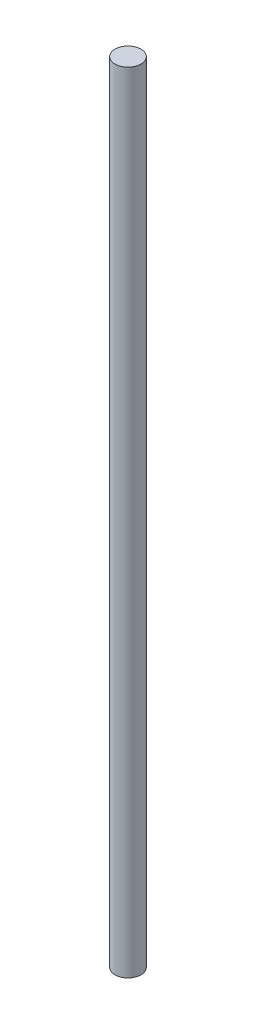
ISO-10303-21;
HEADER;
FILE_DESCRIPTION(('STEP AP214'),'2;1');
FILE_NAME('part.step','',(''),(''),'','','');
FILE_SCHEMA(('AUTOMOTIVE_DESIGN { 1 0 10303 214 1 1 1 1 }'));
ENDSEC;
DATA;
#1=APPLICATION_CONTEXT('core data for automotive mechanical design processes');
#2=APPLICATION_PROTOCOL_DEFINITION('international standard','automotive_design',2000,#1);
#3=PRODUCT_CONTEXT('',#1,'mechanical');
#4=PRODUCT('Part','Part','',(#3));
#5=PRODUCT_RELATED_PRODUCT_CATEGORY('part','',(#4));
#6=PRODUCT_DEFINITION_FORMATION('','',#4);
#7=PRODUCT_DEFINITION_CONTEXT('part definition',#1,'design');
#8=PRODUCT_DEFINITION('design','',#6,#7);
#9=PRODUCT_DEFINITION_SHAPE('','',#8);
#10=(LENGTH_UNIT() NAMED_UNIT(*) SI_UNIT(.MILLI.,.METRE.));
#11=(NAMED_UNIT(*) PLANE_ANGLE_UNIT() SI_UNIT($,.RADIAN.));
#12=(NAMED_UNIT(*) SI_UNIT($,.STERADIAN.) SOLID_ANGLE_UNIT());
#13=UNCERTAINTY_MEASURE_WITH_UNIT(LENGTH_MEASURE(1.E-05),#10,'distance_accuracy_value','');
#14=(GEOMETRIC_REPRESENTATION_CONTEXT(3) GLOBAL_UNCERTAINTY_ASSIGNED_CONTEXT((#13)) GLOBAL_UNIT_ASSIGNED_CONTEXT((#10,
#11,#12)) REPRESENTATION_CONTEXT('',''));
#15=CARTESIAN_POINT('',(0.,0.,0.));
#16=DIRECTION('',(0.,0.,1.));
#17=DIRECTION('',(1.,0.,0.));
#18=AXIS2_PLACEMENT_3D('',#15,#16,#17);
#19=CARTESIAN_POINT('',(0.,38.,0.));
#20=DIRECTION('',(0.,-1.,0.));
#21=DIRECTION('',(0.,0.,-1.));
#22=AXIS2_PLACEMENT_3D('',#19,#20,#21);
#23=CYLINDRICAL_SURFACE('',#22,0.625);
#24=CARTESIAN_POINT('',(0.,38.,0.));
#25=DIRECTION('',(0.,1.,0.));
#26=DIRECTION('',(0.,0.,1.));
#27=AXIS2_PLACEMENT_3D('',#24,#25,#26);
#28=CIRCLE('',#27,0.625);
#29=CARTESIAN_POINT('',(0.,38.,0.625));
#30=VERTEX_POINT('',#29);
#31=EDGE_CURVE('E10',#30,#30,#28,.T.);
#32=ORIENTED_EDGE('',*,*,#31,.F.);
#33=EDGE_LOOP('',(#32));
#34=FACE_BOUND('',#33,.T.);
#35=CARTESIAN_POINT('',(0.,0.,0.));
#36=DIRECTION('',(0.,1.,0.));
#37=DIRECTION('',(0.,0.,1.));
#38=AXIS2_PLACEMENT_3D('',#35,#36,#37);
#39=CIRCLE('',#38,0.625);
#40=CARTESIAN_POINT('',(0.,0.,0.625));
#41=VERTEX_POINT('',#40);
#42=EDGE_CURVE('E32',#41,#41,#39,.T.);
#43=ORIENTED_EDGE('',*,*,#42,.T.);
#44=EDGE_LOOP('',(#43));
#45=FACE_BOUND('',#44,.T.);
#46=ADVANCED_FACE('F29',(#34,#45),#23,.T.);
#47=CARTESIAN_POINT('',(0.,38.,0.));
#48=DIRECTION('',(0.,1.,0.));
#49=DIRECTION('',(0.,0.,1.));
#50=AXIS2_PLACEMENT_3D('',#47,#48,#49);
#51=PLANE('',#50);
#52=ORIENTED_EDGE('',*,*,#31,.T.);
#53=EDGE_LOOP('',(#52));
#54=FACE_BOUND('',#53,.T.);
#55=ADVANCED_FACE('F44',(#54),#51,.T.);
#56=CARTESIAN_POINT('',(0.,0.,0.));
#57=DIRECTION('',(0.,1.,0.));
#58=DIRECTION('',(0.,0.,1.));
#59=AXIS2_PLACEMENT_3D('',#56,#57,#58);
#60=PLANE('',#59);
#61=ORIENTED_EDGE('',*,*,#42,.F.);
#62=EDGE_LOOP('',(#61));
#63=FACE_BOUND('',#62,.T.);
#64=ADVANCED_FACE('F42',(#63),#60,.F.);
#65=CLOSED_SHELL('',(#46,#55,#64));
#66=MANIFOLD_SOLID_BREP('B2',#65);
#67=ADVANCED_BREP_SHAPE_REPRESENTATION('',(#18,#66),#14);
#68=SHAPE_DEFINITION_REPRESENTATION(#9,#67);
ENDSEC;
END-ISO-10303-21;
